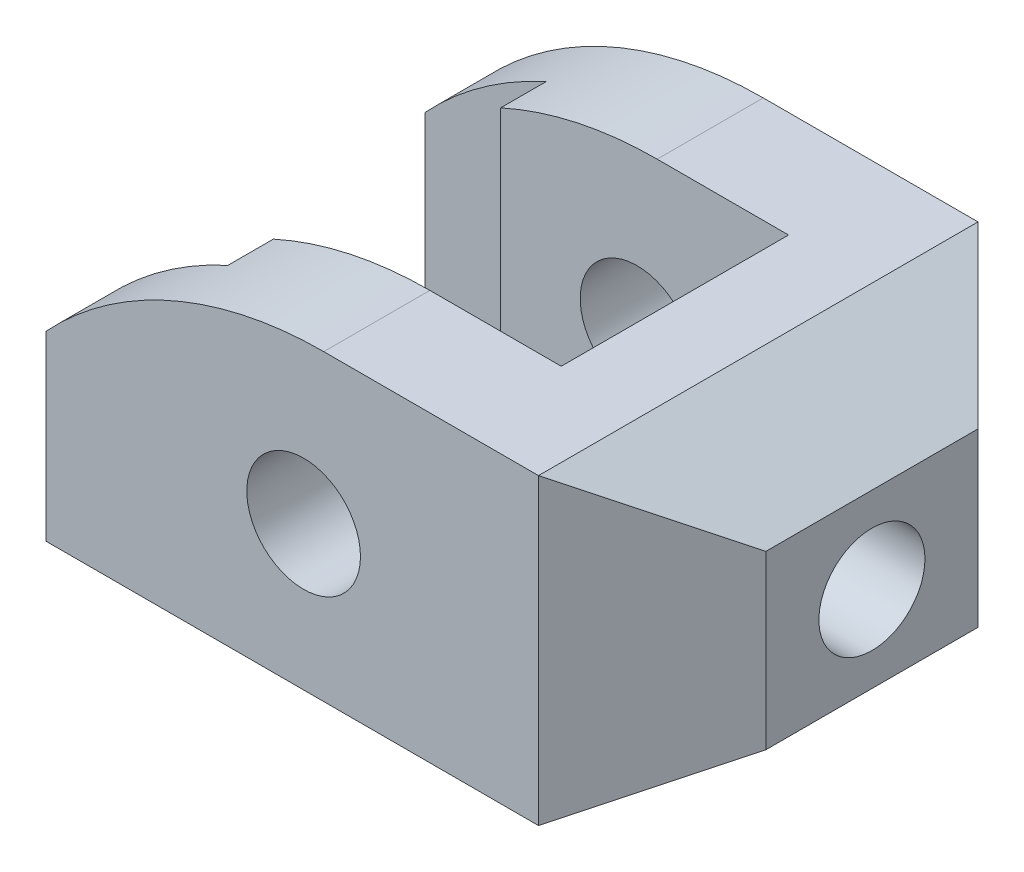
ISO-10303-21;
HEADER;
FILE_DESCRIPTION(('STEP AP214'),'2;1');
FILE_NAME('part.step','',(''),(''),'','','');
FILE_SCHEMA(('AUTOMOTIVE_DESIGN { 1 0 10303 214 1 1 1 1 }'));
ENDSEC;
DATA;
#1=APPLICATION_CONTEXT('core data for automotive mechanical design processes');
#2=APPLICATION_PROTOCOL_DEFINITION('international standard','automotive_design',2000,#1);
#3=PRODUCT_CONTEXT('',#1,'mechanical');
#4=PRODUCT('Part','Part','',(#3));
#5=PRODUCT_RELATED_PRODUCT_CATEGORY('part','',(#4));
#6=PRODUCT_DEFINITION_FORMATION('','',#4);
#7=PRODUCT_DEFINITION_CONTEXT('part definition',#1,'design');
#8=PRODUCT_DEFINITION('design','',#6,#7);
#9=PRODUCT_DEFINITION_SHAPE('','',#8);
#10=(LENGTH_UNIT() NAMED_UNIT(*) SI_UNIT(.MILLI.,.METRE.));
#11=(NAMED_UNIT(*) PLANE_ANGLE_UNIT() SI_UNIT($,.RADIAN.));
#12=(NAMED_UNIT(*) SI_UNIT($,.STERADIAN.) SOLID_ANGLE_UNIT());
#13=UNCERTAINTY_MEASURE_WITH_UNIT(LENGTH_MEASURE(1.E-05),#10,'distance_accuracy_value','');
#14=(GEOMETRIC_REPRESENTATION_CONTEXT(3) GLOBAL_UNCERTAINTY_ASSIGNED_CONTEXT((#13)) GLOBAL_UNIT_ASSIGNED_CONTEXT((#10,
#11,#12)) REPRESENTATION_CONTEXT('',''));
#15=CARTESIAN_POINT('',(0.,0.,0.));
#16=DIRECTION('',(0.,0.,1.));
#17=DIRECTION('',(1.,0.,0.));
#18=AXIS2_PLACEMENT_3D('',#15,#16,#17);
#19=CARTESIAN_POINT('',(-40.,40.,-29.));
#20=DIRECTION('',(1.,0.,0.));
#21=DIRECTION('',(0.,0.,-1.));
#22=AXIS2_PLACEMENT_3D('',#19,#20,#21);
#23=PLANE('',#22);
#24=DIRECTION('',(0.,0.,1.));
#25=VECTOR('',#24,1.);
#26=CARTESIAN_POINT('',(-40.,24.,-66.));
#27=LINE('',#26,#25);
#28=CARTESIAN_POINT('',(-40.,24.,21.));
#29=VERTEX_POINT('',#28);
#30=CARTESIAN_POINT('',(-40.,24.,29.));
#31=VERTEX_POINT('',#30);
#32=EDGE_CURVE('E222',#29,#31,#27,.T.);
#33=ORIENTED_EDGE('',*,*,#32,.F.);
#34=DIRECTION('',(0.,1.,0.));
#35=VECTOR('',#34,1.);
#36=CARTESIAN_POINT('',(-40.,-55.,21.));
#37=LINE('',#36,#35);
#38=CARTESIAN_POINT('',(-40.,0.,21.));
#39=VERTEX_POINT('',#38);
#40=EDGE_CURVE('E170',#39,#29,#37,.T.);
#41=ORIENTED_EDGE('',*,*,#40,.F.);
#42=DIRECTION('',(0.,0.,1.));
#43=VECTOR('',#42,1.);
#44=CARTESIAN_POINT('',(-40.,0.,-29.));
#45=LINE('',#44,#43);
#46=CARTESIAN_POINT('',(-40.,0.,29.));
#47=VERTEX_POINT('',#46);
#48=EDGE_CURVE('E175',#39,#47,#45,.T.);
#49=ORIENTED_EDGE('',*,*,#48,.T.);
#50=DIRECTION('',(0.,-1.,0.));
#51=VECTOR('',#50,1.);
#52=CARTESIAN_POINT('',(-40.,40.,29.));
#53=LINE('',#52,#51);
#54=EDGE_CURVE('E248',#31,#47,#53,.T.);
#55=ORIENTED_EDGE('',*,*,#54,.F.);
#56=EDGE_LOOP('',(#33,#41,#49,#55));
#57=FACE_BOUND('',#56,.T.);
#58=ADVANCED_FACE('F40',(#57),#23,.F.);
#59=CARTESIAN_POINT('',(-40.,0.,-29.));
#60=VERTEX_POINT('',#59);
#61=CARTESIAN_POINT('',(-40.,0.,-21.));
#62=VERTEX_POINT('',#61);
#63=EDGE_CURVE('E251',#60,#62,#45,.T.);
#64=ORIENTED_EDGE('',*,*,#63,.T.);
#65=DIRECTION('',(0.,1.,0.));
#66=VECTOR('',#65,1.);
#67=CARTESIAN_POINT('',(-40.,-55.,-21.));
#68=LINE('',#67,#66);
#69=CARTESIAN_POINT('',(-40.,24.,-21.));
#70=VERTEX_POINT('',#69);
#71=EDGE_CURVE('E289',#62,#70,#68,.T.);
#72=ORIENTED_EDGE('',*,*,#71,.T.);
#73=CARTESIAN_POINT('',(-40.,24.,-29.));
#74=VERTEX_POINT('',#73);
#75=EDGE_CURVE('E223',#74,#70,#27,.T.);
#76=ORIENTED_EDGE('',*,*,#75,.F.);
#77=DIRECTION('',(0.,-1.,0.));
#78=VECTOR('',#77,1.);
#79=CARTESIAN_POINT('',(-40.,40.,-29.));
#80=LINE('',#79,#78);
#81=EDGE_CURVE('E258',#74,#60,#80,.T.);
#82=ORIENTED_EDGE('',*,*,#81,.T.);
#83=EDGE_LOOP('',(#64,#72,#76,#82));
#84=FACE_BOUND('',#83,.T.);
#85=ADVANCED_FACE('F294',(#84),#23,.F.);
#86=CARTESIAN_POINT('',(-40.,40.,29.));
#87=DIRECTION('',(0.,0.,-1.));
#88=DIRECTION('',(-1.,0.,0.));
#89=AXIS2_PLACEMENT_3D('',#86,#87,#88);
#90=PLANE('',#89);
#91=CARTESIAN_POINT('',(-5.99999999999999,19.,29.));
#92=DIRECTION('',(0.,0.,1.));
#93=DIRECTION('',(1.,0.,0.));
#94=AXIS2_PLACEMENT_3D('',#91,#92,#93);
#95=CIRCLE('',#94,7.5);
#96=CARTESIAN_POINT('',(1.50000000000001,19.,29.));
#97=VERTEX_POINT('',#96);
#98=EDGE_CURVE('E229',#97,#97,#95,.T.);
#99=ORIENTED_EDGE('',*,*,#98,.F.);
#100=EDGE_LOOP('',(#99));
#101=FACE_BOUND('',#100,.T.);
#102=DIRECTION('',(0.,1.,0.));
#103=VECTOR('',#102,1.);
#104=CARTESIAN_POINT('',(25.,-55.,29.));
#105=LINE('',#104,#103);
#106=CARTESIAN_POINT('',(25.,0.,29.));
#107=VERTEX_POINT('',#106);
#108=CARTESIAN_POINT('',(25.,40.,29.));
#109=VERTEX_POINT('',#108);
#110=EDGE_CURVE('E178',#107,#109,#105,.T.);
#111=ORIENTED_EDGE('',*,*,#110,.T.);
#112=DIRECTION('',(1.,0.,0.));
#113=VECTOR('',#112,1.);
#114=CARTESIAN_POINT('',(-40.,40.,29.));
#115=LINE('',#114,#113);
#116=CARTESIAN_POINT('',(-3.33939444035328,40.,29.));
#117=VERTEX_POINT('',#116);
#118=EDGE_CURVE('E244',#117,#109,#115,.T.);
#119=ORIENTED_EDGE('',*,*,#118,.F.);
#120=CARTESIAN_POINT('',(-3.33939444035327,-10.,29.));
#121=DIRECTION('',(0.,0.,1.));
#122=DIRECTION('',(1.,0.,0.));
#123=AXIS2_PLACEMENT_3D('',#120,#121,#122);
#124=CIRCLE('',#123,50.);
#125=EDGE_CURVE('E219',#117,#31,#124,.T.);
#126=ORIENTED_EDGE('',*,*,#125,.T.);
#127=ORIENTED_EDGE('',*,*,#54,.T.);
#128=DIRECTION('',(1.,0.,0.));
#129=VECTOR('',#128,1.);
#130=CARTESIAN_POINT('',(-40.,0.,29.));
#131=LINE('',#130,#129);
#132=EDGE_CURVE('E245',#47,#107,#131,.T.);
#133=ORIENTED_EDGE('',*,*,#132,.T.);
#134=EDGE_LOOP('',(#111,#119,#126,#127,#133));
#135=FACE_BOUND('',#134,.T.);
#136=ADVANCED_FACE('F347',(#101,#135),#90,.F.);
#137=CARTESIAN_POINT('',(0.,40.,0.));
#138=DIRECTION('',(0.,1.,0.));
#139=DIRECTION('',(0.,0.,1.));
#140=AXIS2_PLACEMENT_3D('',#137,#138,#139);
#141=PLANE('',#140);
#142=DIRECTION('',(0.,0.,1.));
#143=VECTOR('',#142,1.);
#144=CARTESIAN_POINT('',(14.,40.,0.));
#145=LINE('',#144,#143);
#146=CARTESIAN_POINT('',(14.,40.,-15.));
#147=VERTEX_POINT('',#146);
#148=CARTESIAN_POINT('',(14.,40.,15.));
#149=VERTEX_POINT('',#148);
#150=EDGE_CURVE('E184',#147,#149,#145,.T.);
#151=ORIENTED_EDGE('',*,*,#150,.T.);
#152=DIRECTION('',(-1.,0.,0.));
#153=VECTOR('',#152,1.);
#154=CARTESIAN_POINT('',(0.,40.,15.));
#155=LINE('',#154,#153);
#156=CARTESIAN_POINT('',(-3.33939444035327,40.,15.));
#157=VERTEX_POINT('',#156);
#158=EDGE_CURVE('E191',#149,#157,#155,.T.);
#159=ORIENTED_EDGE('',*,*,#158,.T.);
#160=DIRECTION('',(0.,0.,1.));
#161=VECTOR('',#160,1.);
#162=CARTESIAN_POINT('',(-3.33939444035327,40.,-66.));
#163=LINE('',#162,#161);
#164=EDGE_CURVE('E266',#157,#117,#163,.T.);
#165=ORIENTED_EDGE('',*,*,#164,.T.);
#166=ORIENTED_EDGE('',*,*,#118,.T.);
#167=DIRECTION('',(0.,0.,1.));
#168=VECTOR('',#167,1.);
#169=CARTESIAN_POINT('',(25.,40.,0.));
#170=LINE('',#169,#168);
#171=CARTESIAN_POINT('',(25.,40.,-29.));
#172=VERTEX_POINT('',#171);
#173=EDGE_CURVE('E263',#172,#109,#170,.T.);
#174=ORIENTED_EDGE('',*,*,#173,.F.);
#175=DIRECTION('',(-1.,0.,0.));
#176=VECTOR('',#175,1.);
#177=CARTESIAN_POINT('',(-40.,40.,-29.));
#178=LINE('',#177,#176);
#179=CARTESIAN_POINT('',(-3.33939444035328,40.,-29.));
#180=VERTEX_POINT('',#179);
#181=EDGE_CURVE('E241',#172,#180,#178,.T.);
#182=ORIENTED_EDGE('',*,*,#181,.T.);
#183=CARTESIAN_POINT('',(-3.33939444035327,40.,-15.));
#184=VERTEX_POINT('',#183);
#185=EDGE_CURVE('E267',#180,#184,#163,.T.);
#186=ORIENTED_EDGE('',*,*,#185,.T.);
#187=DIRECTION('',(1.,0.,0.));
#188=VECTOR('',#187,1.);
#189=CARTESIAN_POINT('',(0.,40.,-15.));
#190=LINE('',#189,#188);
#191=EDGE_CURVE('E187',#184,#147,#190,.T.);
#192=ORIENTED_EDGE('',*,*,#191,.T.);
#193=EDGE_LOOP('',(#151,#159,#165,#166,#174,#182,#186,#192));
#194=FACE_BOUND('',#193,.T.);
#195=ADVANCED_FACE('F307',(#194),#141,.T.);
#196=CARTESIAN_POINT('',(40.,40.,-29.));
#197=DIRECTION('',(-1.,0.,0.));
#198=DIRECTION('',(0.,0.,1.));
#199=AXIS2_PLACEMENT_3D('',#196,#197,#198);
#200=PLANE('',#199);
#201=CARTESIAN_POINT('',(40.,20.,0.));
#202=DIRECTION('',(1.,0.,0.));
#203=DIRECTION('',(0.,0.,-1.));
#204=AXIS2_PLACEMENT_3D('',#201,#202,#203);
#205=CIRCLE('',#204,7.);
#206=CARTESIAN_POINT('',(40.,20.,-6.99999999999999));
#207=VERTEX_POINT('',#206);
#208=EDGE_CURVE('E331',#207,#207,#205,.T.);
#209=ORIENTED_EDGE('',*,*,#208,.F.);
#210=EDGE_LOOP('',(#209));
#211=FACE_BOUND('',#210,.T.);
#212=DIRECTION('',(0.,0.,1.));
#213=VECTOR('',#212,1.);
#214=CARTESIAN_POINT('',(40.,8.66025403784427,-66.));
#215=LINE('',#214,#213);
#216=CARTESIAN_POINT('',(40.,8.66025403784426,-14.0000000000002));
#217=VERTEX_POINT('',#216);
#218=CARTESIAN_POINT('',(40.,8.66025403784427,14.0000000000002));
#219=VERTEX_POINT('',#218);
#220=EDGE_CURVE('E228',#217,#219,#215,.T.);
#221=ORIENTED_EDGE('',*,*,#220,.F.);
#222=DIRECTION('',(0.,1.,0.));
#223=VECTOR('',#222,1.);
#224=CARTESIAN_POINT('',(40.,-55.,-14.0000000000002));
#225=LINE('',#224,#223);
#226=CARTESIAN_POINT('',(40.,31.3397459621557,-14.0000000000002));
#227=VERTEX_POINT('',#226);
#228=EDGE_CURVE('E188',#217,#227,#225,.T.);
#229=ORIENTED_EDGE('',*,*,#228,.T.);
#230=DIRECTION('',(0.,0.,1.));
#231=VECTOR('',#230,1.);
#232=CARTESIAN_POINT('',(40.,31.3397459621557,-66.));
#233=LINE('',#232,#231);
#234=CARTESIAN_POINT('',(40.,31.3397459621557,14.0000000000002));
#235=VERTEX_POINT('',#234);
#236=EDGE_CURVE('E233',#227,#235,#233,.T.);
#237=ORIENTED_EDGE('',*,*,#236,.T.);
#238=DIRECTION('',(0.,1.,0.));
#239=VECTOR('',#238,1.);
#240=CARTESIAN_POINT('',(40.,-55.,14.0000000000002));
#241=LINE('',#240,#239);
#242=EDGE_CURVE('E176',#219,#235,#241,.T.);
#243=ORIENTED_EDGE('',*,*,#242,.F.);
#244=EDGE_LOOP('',(#221,#229,#237,#243));
#245=FACE_BOUND('',#244,.T.);
#246=ADVANCED_FACE('F42',(#211,#245),#200,.F.);
#247=CARTESIAN_POINT('',(0.,0.,0.));
#248=DIRECTION('',(0.,1.,0.));
#249=DIRECTION('',(0.,0.,1.));
#250=AXIS2_PLACEMENT_3D('',#247,#248,#249);
#251=PLANE('',#250);
#252=DIRECTION('',(0.,0.,-1.));
#253=VECTOR('',#252,1.);
#254=CARTESIAN_POINT('',(-24.,0.,0.));
#255=LINE('',#254,#253);
#256=CARTESIAN_POINT('',(-24.,0.,-15.));
#257=VERTEX_POINT('',#256);
#258=CARTESIAN_POINT('',(-24.,0.,-21.));
#259=VERTEX_POINT('',#258);
#260=EDGE_CURVE('E64',#257,#259,#255,.T.);
#261=ORIENTED_EDGE('',*,*,#260,.T.);
#262=DIRECTION('',(-1.,0.,0.));
#263=VECTOR('',#262,1.);
#264=CARTESIAN_POINT('',(0.,0.,-21.));
#265=LINE('',#264,#263);
#266=EDGE_CURVE('E162',#259,#62,#265,.T.);
#267=ORIENTED_EDGE('',*,*,#266,.T.);
#268=ORIENTED_EDGE('',*,*,#63,.F.);
#269=DIRECTION('',(-1.,0.,0.));
#270=VECTOR('',#269,1.);
#271=CARTESIAN_POINT('',(-40.,0.,-29.));
#272=LINE('',#271,#270);
#273=CARTESIAN_POINT('',(25.,0.,-29.));
#274=VERTEX_POINT('',#273);
#275=EDGE_CURVE('E240',#274,#60,#272,.T.);
#276=ORIENTED_EDGE('',*,*,#275,.F.);
#277=DIRECTION('',(0.,0.,1.));
#278=VECTOR('',#277,1.);
#279=CARTESIAN_POINT('',(25.,0.,0.));
#280=LINE('',#279,#278);
#281=EDGE_CURVE('E260',#274,#107,#280,.T.);
#282=ORIENTED_EDGE('',*,*,#281,.T.);
#283=ORIENTED_EDGE('',*,*,#132,.F.);
#284=ORIENTED_EDGE('',*,*,#48,.F.);
#285=DIRECTION('',(1.,0.,0.));
#286=VECTOR('',#285,1.);
#287=CARTESIAN_POINT('',(0.,0.,21.));
#288=LINE('',#287,#286);
#289=CARTESIAN_POINT('',(-24.,0.,21.));
#290=VERTEX_POINT('',#289);
#291=EDGE_CURVE('E166',#39,#290,#288,.T.);
#292=ORIENTED_EDGE('',*,*,#291,.T.);
#293=CARTESIAN_POINT('',(-24.,0.,15.));
#294=VERTEX_POINT('',#293);
#295=EDGE_CURVE('E153',#290,#294,#255,.T.);
#296=ORIENTED_EDGE('',*,*,#295,.T.);
#297=DIRECTION('',(-1.,0.,0.));
#298=VECTOR('',#297,1.);
#299=CARTESIAN_POINT('',(0.,0.,15.));
#300=LINE('',#299,#298);
#301=CARTESIAN_POINT('',(14.,0.,15.));
#302=VERTEX_POINT('',#301);
#303=EDGE_CURVE('E212',#302,#294,#300,.T.);
#304=ORIENTED_EDGE('',*,*,#303,.F.);
#305=DIRECTION('',(0.,0.,1.));
#306=VECTOR('',#305,1.);
#307=CARTESIAN_POINT('',(14.,0.,0.));
#308=LINE('',#307,#306);
#309=CARTESIAN_POINT('',(14.,0.,-15.));
#310=VERTEX_POINT('',#309);
#311=EDGE_CURVE('E280',#310,#302,#308,.T.);
#312=ORIENTED_EDGE('',*,*,#311,.F.);
#313=DIRECTION('',(1.,0.,0.));
#314=VECTOR('',#313,1.);
#315=CARTESIAN_POINT('',(0.,0.,-15.));
#316=LINE('',#315,#314);
#317=EDGE_CURVE('E207',#257,#310,#316,.T.);
#318=ORIENTED_EDGE('',*,*,#317,.F.);
#319=EDGE_LOOP('',(#261,#267,#268,#276,#282,#283,#284,#292,#296,#304,#312,#318));
#320=FACE_BOUND('',#319,.T.);
#321=ADVANCED_FACE('F173',(#320),#251,.F.);
#322=CARTESIAN_POINT('',(40.,8.66025403784427,-66.));
#323=DIRECTION('',(-0.499999999999995,0.866025403784442,0.));
#324=DIRECTION('',(-0.866025403784442,-0.499999999999995,0.));
#325=AXIS2_PLACEMENT_3D('',#322,#323,#324);
#326=PLANE('',#325);
#327=ORIENTED_EDGE('',*,*,#281,.F.);
#328=DIRECTION('',(0.654653670707982,0.377964473009225,0.654653670707974));
#329=VECTOR('',#328,1.);
#330=CARTESIAN_POINT('',(17.7142857142857,-4.20640910409578,-36.2857142857142));
#331=LINE('',#330,#329);
#332=EDGE_CURVE('E216',#274,#217,#331,.T.);
#333=ORIENTED_EDGE('',*,*,#332,.T.);
#334=ORIENTED_EDGE('',*,*,#220,.T.);
#335=DIRECTION('',(0.654653670707981,0.377964473009224,-0.654653670707975));
#336=VECTOR('',#335,1.);
#337=CARTESIAN_POINT('',(74.2857142857145,28.4551204100598,-20.2857142857139));
#338=LINE('',#337,#336);
#339=EDGE_CURVE('E214',#107,#219,#338,.T.);
#340=ORIENTED_EDGE('',*,*,#339,.F.);
#341=EDGE_LOOP('',(#327,#333,#334,#340));
#342=FACE_BOUND('',#341,.T.);
#343=ADVANCED_FACE('F321',(#342),#326,.F.);
#344=CARTESIAN_POINT('',(40.,31.3397459621557,-66.));
#345=DIRECTION('',(-0.499999999999995,-0.866025403784442,0.));
#346=DIRECTION('',(0.866025403784442,-0.499999999999995,0.));
#347=AXIS2_PLACEMENT_3D('',#344,#345,#346);
#348=PLANE('',#347);
#349=ORIENTED_EDGE('',*,*,#236,.F.);
#350=DIRECTION('',(-0.654653670707982,0.377964473009225,-0.654653670707974));
#351=VECTOR('',#350,1.);
#352=CARTESIAN_POINT('',(17.7142857142857,44.2064091040958,-36.2857142857142));
#353=LINE('',#352,#351);
#354=EDGE_CURVE('E277',#227,#172,#353,.T.);
#355=ORIENTED_EDGE('',*,*,#354,.T.);
#356=ORIENTED_EDGE('',*,*,#173,.T.);
#357=DIRECTION('',(-0.654653670707981,0.377964473009225,0.654653670707975));
#358=VECTOR('',#357,1.);
#359=CARTESIAN_POINT('',(74.2857142857145,11.5448795899402,-20.2857142857139));
#360=LINE('',#359,#358);
#361=EDGE_CURVE('E275',#235,#109,#360,.T.);
#362=ORIENTED_EDGE('',*,*,#361,.F.);
#363=EDGE_LOOP('',(#349,#355,#356,#362));
#364=FACE_BOUND('',#363,.T.);
#365=ADVANCED_FACE('F312',(#364),#348,.F.);
#366=CARTESIAN_POINT('',(-5.99999999999999,19.,-66.));
#367=DIRECTION('',(0.,0.,1.));
#368=DIRECTION('',(1.,0.,0.));
#369=AXIS2_PLACEMENT_3D('',#366,#367,#368);
#370=CYLINDRICAL_SURFACE('',#369,7.5);
#371=ORIENTED_EDGE('',*,*,#98,.T.);
#372=EDGE_LOOP('',(#371));
#373=FACE_BOUND('',#372,.T.);
#374=CARTESIAN_POINT('',(-5.99999999999999,19.,15.));
#375=DIRECTION('',(0.,0.,-1.));
#376=DIRECTION('',(-1.,0.,0.));
#377=AXIS2_PLACEMENT_3D('',#374,#375,#376);
#378=CIRCLE('',#377,7.5);
#379=CARTESIAN_POINT('',(-13.5,19.,15.));
#380=VERTEX_POINT('',#379);
#381=EDGE_CURVE('E209',#380,#380,#378,.F.);
#382=ORIENTED_EDGE('',*,*,#381,.F.);
#383=EDGE_LOOP('',(#382));
#384=FACE_BOUND('',#383,.T.);
#385=ADVANCED_FACE('F376',(#373,#384),#370,.F.);
#386=CARTESIAN_POINT('',(-5.99999999999999,19.,-29.));
#387=DIRECTION('',(0.,0.,1.));
#388=DIRECTION('',(1.,0.,0.));
#389=AXIS2_PLACEMENT_3D('',#386,#387,#388);
#390=CIRCLE('',#389,7.5);
#391=CARTESIAN_POINT('',(1.50000000000001,19.,-29.));
#392=VERTEX_POINT('',#391);
#393=EDGE_CURVE('E232',#392,#392,#390,.T.);
#394=ORIENTED_EDGE('',*,*,#393,.F.);
#395=EDGE_LOOP('',(#394));
#396=FACE_BOUND('',#395,.T.);
#397=CARTESIAN_POINT('',(-5.99999999999999,19.,-15.));
#398=DIRECTION('',(0.,0.,1.));
#399=DIRECTION('',(1.,0.,0.));
#400=AXIS2_PLACEMENT_3D('',#397,#398,#399);
#401=CIRCLE('',#400,7.5);
#402=CARTESIAN_POINT('',(1.50000000000001,19.,-15.));
#403=VERTEX_POINT('',#402);
#404=EDGE_CURVE('E197',#403,#403,#401,.F.);
#405=ORIENTED_EDGE('',*,*,#404,.F.);
#406=EDGE_LOOP('',(#405));
#407=FACE_BOUND('',#406,.T.);
#408=ADVANCED_FACE('F374',(#396,#407),#370,.F.);
#409=CARTESIAN_POINT('',(-3.33939444035327,-10.,-66.));
#410=DIRECTION('',(0.,0.,1.));
#411=DIRECTION('',(1.,0.,0.));
#412=AXIS2_PLACEMENT_3D('',#409,#410,#411);
#413=CYLINDRICAL_SURFACE('',#412,50.);
#414=DIRECTION('',(0.,0.,1.));
#415=VECTOR('',#414,1.);
#416=CARTESIAN_POINT('',(-24.,35.5317403347236,-66.));
#417=LINE('',#416,#415);
#418=CARTESIAN_POINT('',(-24.,35.5317403347236,21.));
#419=VERTEX_POINT('',#418);
#420=CARTESIAN_POINT('',(-24.,35.5317403347236,15.));
#421=VERTEX_POINT('',#420);
#422=EDGE_CURVE('E56',#419,#421,#417,.F.);
#423=ORIENTED_EDGE('',*,*,#422,.F.);
#424=CARTESIAN_POINT('',(-3.33939444035327,-10.,21.));
#425=DIRECTION('',(0.,0.,1.));
#426=DIRECTION('',(1.,0.,0.));
#427=AXIS2_PLACEMENT_3D('',#424,#425,#426);
#428=CIRCLE('',#427,50.);
#429=EDGE_CURVE('E11',#29,#419,#428,.F.);
#430=ORIENTED_EDGE('',*,*,#429,.F.);
#431=ORIENTED_EDGE('',*,*,#32,.T.);
#432=ORIENTED_EDGE('',*,*,#125,.F.);
#433=ORIENTED_EDGE('',*,*,#164,.F.);
#434=CARTESIAN_POINT('',(-3.33939444035327,-10.,15.));
#435=DIRECTION('',(0.,0.,-1.));
#436=DIRECTION('',(-1.,0.,0.));
#437=AXIS2_PLACEMENT_3D('',#434,#435,#436);
#438=CIRCLE('',#437,50.);
#439=EDGE_CURVE('E272',#157,#421,#438,.F.);
#440=ORIENTED_EDGE('',*,*,#439,.T.);
#441=EDGE_LOOP('',(#423,#430,#431,#432,#433,#440));
#442=FACE_BOUND('',#441,.T.);
#443=ADVANCED_FACE('F370',(#442),#413,.T.);
#444=CARTESIAN_POINT('',(-3.33939444035327,-10.,-21.));
#445=DIRECTION('',(0.,0.,-1.));
#446=DIRECTION('',(-1.,0.,0.));
#447=AXIS2_PLACEMENT_3D('',#444,#445,#446);
#448=CIRCLE('',#447,50.);
#449=CARTESIAN_POINT('',(-24.,35.5317403347236,-21.));
#450=VERTEX_POINT('',#449);
#451=EDGE_CURVE('E49',#450,#70,#448,.F.);
#452=ORIENTED_EDGE('',*,*,#451,.F.);
#453=DIRECTION('',(0.,0.,1.));
#454=VECTOR('',#453,1.);
#455=CARTESIAN_POINT('',(-24.,35.5317403347236,-66.));
#456=LINE('',#455,#454);
#457=CARTESIAN_POINT('',(-24.,35.5317403347236,-15.));
#458=VERTEX_POINT('',#457);
#459=EDGE_CURVE('E297',#458,#450,#456,.F.);
#460=ORIENTED_EDGE('',*,*,#459,.F.);
#461=CARTESIAN_POINT('',(-3.33939444035327,-10.,-15.));
#462=DIRECTION('',(0.,0.,1.));
#463=DIRECTION('',(1.,0.,0.));
#464=AXIS2_PLACEMENT_3D('',#461,#462,#463);
#465=CIRCLE('',#464,50.);
#466=EDGE_CURVE('E270',#458,#184,#465,.F.);
#467=ORIENTED_EDGE('',*,*,#466,.T.);
#468=ORIENTED_EDGE('',*,*,#185,.F.);
#469=CARTESIAN_POINT('',(-3.33939444035327,-10.,-29.));
#470=DIRECTION('',(0.,0.,1.));
#471=DIRECTION('',(1.,0.,0.));
#472=AXIS2_PLACEMENT_3D('',#469,#470,#471);
#473=CIRCLE('',#472,50.);
#474=EDGE_CURVE('E226',#180,#74,#473,.T.);
#475=ORIENTED_EDGE('',*,*,#474,.T.);
#476=ORIENTED_EDGE('',*,*,#75,.T.);
#477=EDGE_LOOP('',(#452,#460,#467,#468,#475,#476));
#478=FACE_BOUND('',#477,.T.);
#479=ADVANCED_FACE('F299',(#478),#413,.T.);
#480=CARTESIAN_POINT('',(-40.,40.,-29.));
#481=DIRECTION('',(0.,0.,1.));
#482=DIRECTION('',(1.,0.,0.));
#483=AXIS2_PLACEMENT_3D('',#480,#481,#482);
#484=PLANE('',#483);
#485=ORIENTED_EDGE('',*,*,#393,.T.);
#486=EDGE_LOOP('',(#485));
#487=FACE_BOUND('',#486,.T.);
#488=ORIENTED_EDGE('',*,*,#181,.F.);
#489=DIRECTION('',(0.,1.,0.));
#490=VECTOR('',#489,1.);
#491=CARTESIAN_POINT('',(25.,-55.,-29.));
#492=LINE('',#491,#490);
#493=EDGE_CURVE('E201',#274,#172,#492,.T.);
#494=ORIENTED_EDGE('',*,*,#493,.F.);
#495=ORIENTED_EDGE('',*,*,#275,.T.);
#496=ORIENTED_EDGE('',*,*,#81,.F.);
#497=ORIENTED_EDGE('',*,*,#474,.F.);
#498=EDGE_LOOP('',(#488,#494,#495,#496,#497));
#499=FACE_BOUND('',#498,.T.);
#500=ADVANCED_FACE('F303',(#487,#499),#484,.F.);
#501=CARTESIAN_POINT('',(14.,-55.,0.));
#502=DIRECTION('',(-1.,0.,0.));
#503=DIRECTION('',(0.,0.,1.));
#504=AXIS2_PLACEMENT_3D('',#501,#502,#503);
#505=PLANE('',#504);
#506=CARTESIAN_POINT('',(14.,20.,0.));
#507=DIRECTION('',(-1.,0.,0.));
#508=DIRECTION('',(0.,0.,1.));
#509=AXIS2_PLACEMENT_3D('',#506,#507,#508);
#510=CIRCLE('',#509,7.);
#511=CARTESIAN_POINT('',(14.,20.,7.00000000000002));
#512=VERTEX_POINT('',#511);
#513=EDGE_CURVE('E44',#512,#512,#510,.T.);
#514=ORIENTED_EDGE('',*,*,#513,.F.);
#515=EDGE_LOOP('',(#514));
#516=FACE_BOUND('',#515,.T.);
#517=ORIENTED_EDGE('',*,*,#311,.T.);
#518=DIRECTION('',(0.,1.,0.));
#519=VECTOR('',#518,1.);
#520=CARTESIAN_POINT('',(14.,-55.,15.));
#521=LINE('',#520,#519);
#522=EDGE_CURVE('E195',#302,#149,#521,.T.);
#523=ORIENTED_EDGE('',*,*,#522,.T.);
#524=ORIENTED_EDGE('',*,*,#150,.F.);
#525=DIRECTION('',(0.,1.,0.));
#526=VECTOR('',#525,1.);
#527=CARTESIAN_POINT('',(14.,-55.,-15.));
#528=LINE('',#527,#526);
#529=EDGE_CURVE('E194',#310,#147,#528,.T.);
#530=ORIENTED_EDGE('',*,*,#529,.F.);
#531=EDGE_LOOP('',(#517,#523,#524,#530));
#532=FACE_BOUND('',#531,.T.);
#533=ADVANCED_FACE('F359',(#516,#532),#505,.T.);
#534=CARTESIAN_POINT('',(0.,-55.,15.));
#535=DIRECTION('',(0.,0.,-1.));
#536=DIRECTION('',(-1.,0.,0.));
#537=AXIS2_PLACEMENT_3D('',#534,#535,#536);
#538=PLANE('',#537);
#539=DIRECTION('',(0.,-1.,0.));
#540=VECTOR('',#539,1.);
#541=CARTESIAN_POINT('',(-24.,-55.,15.));
#542=LINE('',#541,#540);
#543=EDGE_CURVE('E157',#421,#294,#542,.T.);
#544=ORIENTED_EDGE('',*,*,#543,.F.);
#545=ORIENTED_EDGE('',*,*,#439,.F.);
#546=ORIENTED_EDGE('',*,*,#158,.F.);
#547=ORIENTED_EDGE('',*,*,#522,.F.);
#548=ORIENTED_EDGE('',*,*,#303,.T.);
#549=EDGE_LOOP('',(#544,#545,#546,#547,#548));
#550=FACE_BOUND('',#549,.T.);
#551=ORIENTED_EDGE('',*,*,#381,.T.);
#552=EDGE_LOOP('',(#551));
#553=FACE_BOUND('',#552,.T.);
#554=ADVANCED_FACE('F366',(#550,#553),#538,.T.);
#555=CARTESIAN_POINT('',(0.,-55.,-15.));
#556=DIRECTION('',(0.,0.,1.));
#557=DIRECTION('',(1.,0.,0.));
#558=AXIS2_PLACEMENT_3D('',#555,#556,#557);
#559=PLANE('',#558);
#560=DIRECTION('',(0.,1.,0.));
#561=VECTOR('',#560,1.);
#562=CARTESIAN_POINT('',(-24.,-55.,-15.));
#563=LINE('',#562,#561);
#564=EDGE_CURVE('E282',#257,#458,#563,.T.);
#565=ORIENTED_EDGE('',*,*,#564,.F.);
#566=ORIENTED_EDGE('',*,*,#317,.T.);
#567=ORIENTED_EDGE('',*,*,#529,.T.);
#568=ORIENTED_EDGE('',*,*,#191,.F.);
#569=ORIENTED_EDGE('',*,*,#466,.F.);
#570=EDGE_LOOP('',(#565,#566,#567,#568,#569));
#571=FACE_BOUND('',#570,.T.);
#572=ORIENTED_EDGE('',*,*,#404,.T.);
#573=EDGE_LOOP('',(#572));
#574=FACE_BOUND('',#573,.T.);
#575=ADVANCED_FACE('F380',(#571,#574),#559,.T.);
#576=CARTESIAN_POINT('',(26.9999999999999,-55.,27.0000000000002));
#577=DIRECTION('',(0.707106781186544,0.,0.707106781186551));
#578=DIRECTION('',(0.707106781186551,0.,-0.707106781186544));
#579=AXIS2_PLACEMENT_3D('',#576,#577,#578);
#580=PLANE('',#579);
#581=ORIENTED_EDGE('',*,*,#339,.T.);
#582=ORIENTED_EDGE('',*,*,#242,.T.);
#583=ORIENTED_EDGE('',*,*,#361,.T.);
#584=ORIENTED_EDGE('',*,*,#110,.F.);
#585=EDGE_LOOP('',(#581,#582,#583,#584));
#586=FACE_BOUND('',#585,.T.);
#587=ADVANCED_FACE('F382',(#586),#580,.T.);
#588=CARTESIAN_POINT('',(26.9999999999999,-55.,-27.0000000000002));
#589=DIRECTION('',(-0.707106781186543,0.,0.707106781186552));
#590=DIRECTION('',(0.707106781186552,0.,0.707106781186543));
#591=AXIS2_PLACEMENT_3D('',#588,#589,#590);
#592=PLANE('',#591);
#593=ORIENTED_EDGE('',*,*,#493,.T.);
#594=ORIENTED_EDGE('',*,*,#354,.F.);
#595=ORIENTED_EDGE('',*,*,#228,.F.);
#596=ORIENTED_EDGE('',*,*,#332,.F.);
#597=EDGE_LOOP('',(#593,#594,#595,#596));
#598=FACE_BOUND('',#597,.T.);
#599=ADVANCED_FACE('F314',(#598),#592,.F.);
#600=CARTESIAN_POINT('',(-24.,-55.,-21.));
#601=DIRECTION('',(1.,0.,0.));
#602=DIRECTION('',(0.,0.,-1.));
#603=AXIS2_PLACEMENT_3D('',#600,#601,#602);
#604=PLANE('',#603);
#605=ORIENTED_EDGE('',*,*,#564,.T.);
#606=ORIENTED_EDGE('',*,*,#459,.T.);
#607=DIRECTION('',(0.,1.,0.));
#608=VECTOR('',#607,1.);
#609=CARTESIAN_POINT('',(-24.,-55.,-21.));
#610=LINE('',#609,#608);
#611=EDGE_CURVE('E169',#259,#450,#610,.T.);
#612=ORIENTED_EDGE('',*,*,#611,.F.);
#613=ORIENTED_EDGE('',*,*,#260,.F.);
#614=EDGE_LOOP('',(#605,#606,#612,#613));
#615=FACE_BOUND('',#614,.T.);
#616=ADVANCED_FACE('F324',(#615),#604,.F.);
#617=CARTESIAN_POINT('',(-40.,-55.,-21.));
#618=DIRECTION('',(0.,0.,-1.));
#619=DIRECTION('',(-1.,0.,0.));
#620=AXIS2_PLACEMENT_3D('',#617,#618,#619);
#621=PLANE('',#620);
#622=ORIENTED_EDGE('',*,*,#611,.T.);
#623=ORIENTED_EDGE('',*,*,#451,.T.);
#624=ORIENTED_EDGE('',*,*,#71,.F.);
#625=ORIENTED_EDGE('',*,*,#266,.F.);
#626=EDGE_LOOP('',(#622,#623,#624,#625));
#627=FACE_BOUND('',#626,.T.);
#628=ADVANCED_FACE('F288',(#627),#621,.F.);
#629=CARTESIAN_POINT('',(-24.,-55.,21.));
#630=DIRECTION('',(0.,0.,1.));
#631=DIRECTION('',(1.,0.,0.));
#632=AXIS2_PLACEMENT_3D('',#629,#630,#631);
#633=PLANE('',#632);
#634=ORIENTED_EDGE('',*,*,#40,.T.);
#635=ORIENTED_EDGE('',*,*,#429,.T.);
#636=DIRECTION('',(0.,1.,0.));
#637=VECTOR('',#636,1.);
#638=CARTESIAN_POINT('',(-24.,-55.,21.));
#639=LINE('',#638,#637);
#640=EDGE_CURVE('E156',#290,#419,#639,.T.);
#641=ORIENTED_EDGE('',*,*,#640,.F.);
#642=ORIENTED_EDGE('',*,*,#291,.F.);
#643=EDGE_LOOP('',(#634,#635,#641,#642));
#644=FACE_BOUND('',#643,.T.);
#645=ADVANCED_FACE('F165',(#644),#633,.F.);
#646=ORIENTED_EDGE('',*,*,#640,.T.);
#647=ORIENTED_EDGE('',*,*,#422,.T.);
#648=ORIENTED_EDGE('',*,*,#543,.T.);
#649=ORIENTED_EDGE('',*,*,#295,.F.);
#650=EDGE_LOOP('',(#646,#647,#648,#649));
#651=FACE_BOUND('',#650,.T.);
#652=ADVANCED_FACE('F155',(#651),#604,.F.);
#653=CARTESIAN_POINT('',(-55.,20.,0.));
#654=DIRECTION('',(1.,0.,0.));
#655=DIRECTION('',(0.,0.,-1.));
#656=AXIS2_PLACEMENT_3D('',#653,#654,#655);
#657=CYLINDRICAL_SURFACE('',#656,7.);
#658=ORIENTED_EDGE('',*,*,#513,.T.);
#659=EDGE_LOOP('',(#658));
#660=FACE_BOUND('',#659,.T.);
#661=ORIENTED_EDGE('',*,*,#208,.T.);
#662=EDGE_LOOP('',(#661));
#663=FACE_BOUND('',#662,.T.);
#664=ADVANCED_FACE('F337',(#660,#663),#657,.F.);
#665=CLOSED_SHELL('',(#58,#85,#136,#195,#246,#321,#343,#365,#385,#408,#443,#479,#500,#533,#554,
#575,#587,#599,#616,#628,#645,#652,#664));
#666=MANIFOLD_SOLID_BREP('B2',#665);
#667=ADVANCED_BREP_SHAPE_REPRESENTATION('',(#18,#666),#14);
#668=SHAPE_DEFINITION_REPRESENTATION(#9,#667);
ENDSEC;
END-ISO-10303-21;
